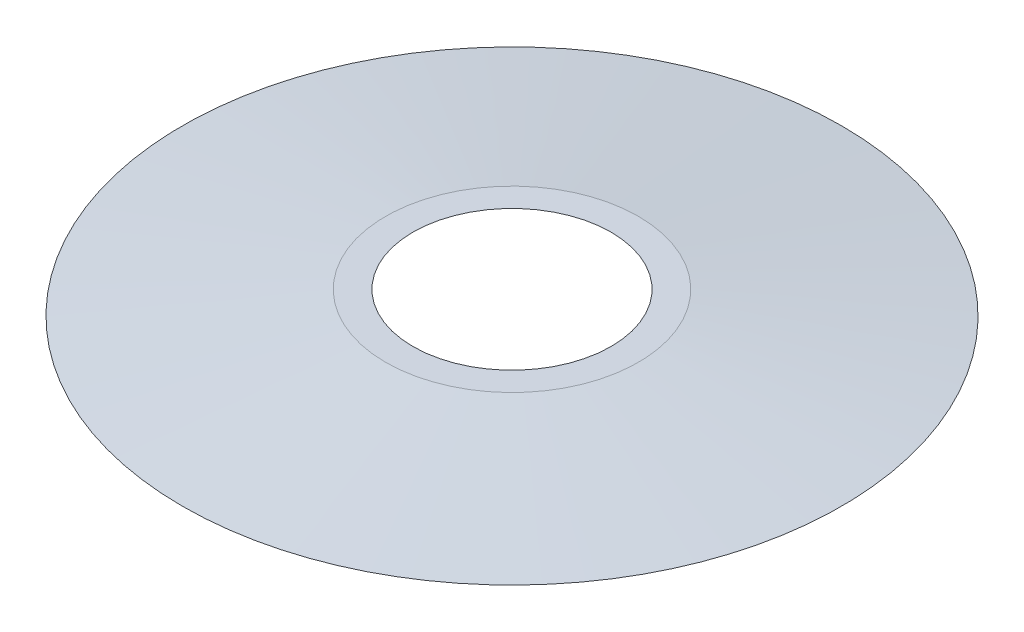
ISO-10303-21;
HEADER;
FILE_DESCRIPTION(('STEP AP214'),'2;1');
FILE_NAME('part.step','',(''),(''),'','','');
FILE_SCHEMA(('AUTOMOTIVE_DESIGN { 1 0 10303 214 1 1 1 1 }'));
ENDSEC;
DATA;
#1=APPLICATION_CONTEXT('core data for automotive mechanical design processes');
#2=APPLICATION_PROTOCOL_DEFINITION('international standard','automotive_design',2000,#1);
#3=PRODUCT_CONTEXT('',#1,'mechanical');
#4=PRODUCT('Part','Part','',(#3));
#5=PRODUCT_RELATED_PRODUCT_CATEGORY('part','',(#4));
#6=PRODUCT_DEFINITION_FORMATION('','',#4);
#7=PRODUCT_DEFINITION_CONTEXT('part definition',#1,'design');
#8=PRODUCT_DEFINITION('design','',#6,#7);
#9=PRODUCT_DEFINITION_SHAPE('','',#8);
#10=(LENGTH_UNIT() NAMED_UNIT(*) SI_UNIT(.MILLI.,.METRE.));
#11=(NAMED_UNIT(*) PLANE_ANGLE_UNIT() SI_UNIT($,.RADIAN.));
#12=(NAMED_UNIT(*) SI_UNIT($,.STERADIAN.) SOLID_ANGLE_UNIT());
#13=UNCERTAINTY_MEASURE_WITH_UNIT(LENGTH_MEASURE(1.E-05),#10,'distance_accuracy_value','');
#14=(GEOMETRIC_REPRESENTATION_CONTEXT(3) GLOBAL_UNCERTAINTY_ASSIGNED_CONTEXT((#13)) GLOBAL_UNIT_ASSIGNED_CONTEXT((#10,
#11,#12)) REPRESENTATION_CONTEXT('',''));
#15=CARTESIAN_POINT('',(0.,0.,0.));
#16=DIRECTION('',(0.,0.,1.));
#17=DIRECTION('',(1.,0.,0.));
#18=AXIS2_PLACEMENT_3D('',#15,#16,#17);
#19=CARTESIAN_POINT('',(0.,1.70807142886834,0.));
#20=DIRECTION('',(0.,-1.,0.));
#21=DIRECTION('',(0.,0.,-1.));
#22=AXIS2_PLACEMENT_3D('',#19,#20,#21);
#23=CONICAL_SURFACE('',#22,14.6522528512523,1.42361761125934);
#24=CARTESIAN_POINT('',(0.,-1.70807142886834,0.));
#25=DIRECTION('',(0.,1.,0.));
#26=DIRECTION('',(0.,0.,1.));
#27=AXIS2_PLACEMENT_3D('',#24,#25,#26);
#28=CIRCLE('',#27,37.6952642462243);
#29=CARTESIAN_POINT('',(0.,-1.70807142886834,37.6952642462243));
#30=VERTEX_POINT('',#29);
#31=EDGE_CURVE('E10',#30,#30,#28,.T.);
#32=ORIENTED_EDGE('',*,*,#31,.F.);
#33=EDGE_LOOP('',(#32));
#34=FACE_BOUND('',#33,.T.);
#35=CARTESIAN_POINT('',(0.,1.70807142886834,0.));
#36=DIRECTION('',(0.,1.,0.));
#37=DIRECTION('',(0.,0.,1.));
#38=AXIS2_PLACEMENT_3D('',#35,#36,#37);
#39=CIRCLE('',#38,14.6522528512523);
#40=CARTESIAN_POINT('',(0.,1.70807142886834,14.6522528512523));
#41=VERTEX_POINT('',#40);
#42=EDGE_CURVE('E53',#41,#41,#39,.T.);
#43=ORIENTED_EDGE('',*,*,#42,.T.);
#44=EDGE_LOOP('',(#43));
#45=FACE_BOUND('',#44,.T.);
#46=ADVANCED_FACE('F39',(#34,#45),#23,.F.);
#47=CARTESIAN_POINT('',(37.6952642462243,-1.70807142886834,0.));
#48=DIRECTION('',(0.,1.,0.));
#49=DIRECTION('',(0.,0.,1.));
#50=AXIS2_PLACEMENT_3D('',#47,#48,#49);
#51=PLANE('',#50);
#52=CARTESIAN_POINT('',(0.,-1.70807142886835,0.));
#53=DIRECTION('',(0.,1.,0.));
#54=DIRECTION('',(0.,0.,1.));
#55=AXIS2_PLACEMENT_3D('',#52,#53,#54);
#56=CIRCLE('',#55,48.7461495648786);
#57=CARTESIAN_POINT('',(0.,-1.70807142886835,48.7461495648786));
#58=VERTEX_POINT('',#57);
#59=EDGE_CURVE('E45',#58,#58,#56,.T.);
#60=ORIENTED_EDGE('',*,*,#59,.F.);
#61=EDGE_LOOP('',(#60));
#62=FACE_BOUND('',#61,.T.);
#63=ORIENTED_EDGE('',*,*,#31,.T.);
#64=EDGE_LOOP('',(#63));
#65=FACE_BOUND('',#64,.T.);
#66=ADVANCED_FACE('F68',(#62,#65),#51,.F.);
#67=CARTESIAN_POINT('',(0.,-1.70807142886835,0.));
#68=DIRECTION('',(0.,-1.,0.));
#69=DIRECTION('',(0.,0.,-1.));
#70=AXIS2_PLACEMENT_3D('',#67,#68,#69);
#71=CONICAL_SURFACE('',#70,48.7461495648786,1.45758893318411);
#72=CARTESIAN_POINT('',(0.,1.70807142886835,0.));
#73=DIRECTION('',(0.,1.,0.));
#74=DIRECTION('',(0.,0.,1.));
#75=AXIS2_PLACEMENT_3D('',#72,#73,#74);
#76=CIRCLE('',#75,18.6992012080654);
#77=CARTESIAN_POINT('',(0.,1.70807142886835,18.6992012080654));
#78=VERTEX_POINT('',#77);
#79=EDGE_CURVE('E49',#78,#78,#76,.T.);
#80=ORIENTED_EDGE('',*,*,#79,.F.);
#81=EDGE_LOOP('',(#80));
#82=FACE_BOUND('',#81,.T.);
#83=ORIENTED_EDGE('',*,*,#59,.T.);
#84=EDGE_LOOP('',(#83));
#85=FACE_BOUND('',#84,.T.);
#86=ADVANCED_FACE('F63',(#82,#85),#71,.T.);
#87=CARTESIAN_POINT('',(14.6522528512523,1.70807142886834,0.));
#88=DIRECTION('',(0.,-1.,0.));
#89=DIRECTION('',(0.,0.,-1.));
#90=AXIS2_PLACEMENT_3D('',#87,#88,#89);
#91=PLANE('',#90);
#92=ORIENTED_EDGE('',*,*,#42,.F.);
#93=EDGE_LOOP('',(#92));
#94=FACE_BOUND('',#93,.T.);
#95=ORIENTED_EDGE('',*,*,#79,.T.);
#96=EDGE_LOOP('',(#95));
#97=FACE_BOUND('',#96,.T.);
#98=ADVANCED_FACE('F60',(#94,#97),#91,.F.);
#99=CLOSED_SHELL('',(#46,#66,#86,#98));
#100=MANIFOLD_SOLID_BREP('B2',#99);
#101=ADVANCED_BREP_SHAPE_REPRESENTATION('',(#18,#100),#14);
#102=SHAPE_DEFINITION_REPRESENTATION(#9,#101);
ENDSEC;
END-ISO-10303-21;
